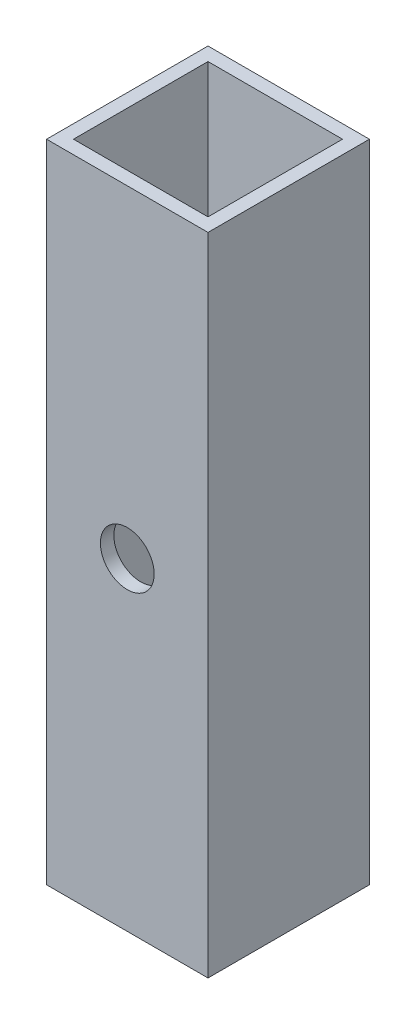
ISO-10303-21;
HEADER;
FILE_DESCRIPTION(('STEP AP214'),'2;1');
FILE_NAME('part.step','',(''),(''),'','','');
FILE_SCHEMA(('AUTOMOTIVE_DESIGN { 1 0 10303 214 1 1 1 1 }'));
ENDSEC;
DATA;
#1=APPLICATION_CONTEXT('core data for automotive mechanical design processes');
#2=APPLICATION_PROTOCOL_DEFINITION('international standard','automotive_design',2000,#1);
#3=PRODUCT_CONTEXT('',#1,'mechanical');
#4=PRODUCT('Part','Part','',(#3));
#5=PRODUCT_RELATED_PRODUCT_CATEGORY('part','',(#4));
#6=PRODUCT_DEFINITION_FORMATION('','',#4);
#7=PRODUCT_DEFINITION_CONTEXT('part definition',#1,'design');
#8=PRODUCT_DEFINITION('design','',#6,#7);
#9=PRODUCT_DEFINITION_SHAPE('','',#8);
#10=(LENGTH_UNIT() NAMED_UNIT(*) SI_UNIT(.MILLI.,.METRE.));
#11=(NAMED_UNIT(*) PLANE_ANGLE_UNIT() SI_UNIT($,.RADIAN.));
#12=(NAMED_UNIT(*) SI_UNIT($,.STERADIAN.) SOLID_ANGLE_UNIT());
#13=UNCERTAINTY_MEASURE_WITH_UNIT(LENGTH_MEASURE(1.E-05),#10,'distance_accuracy_value','');
#14=(GEOMETRIC_REPRESENTATION_CONTEXT(3) GLOBAL_UNCERTAINTY_ASSIGNED_CONTEXT((#13)) GLOBAL_UNIT_ASSIGNED_CONTEXT((#10,
#11,#12)) REPRESENTATION_CONTEXT('',''));
#15=CARTESIAN_POINT('',(0.,0.,0.));
#16=DIRECTION('',(0.,0.,1.));
#17=DIRECTION('',(1.,0.,0.));
#18=AXIS2_PLACEMENT_3D('',#15,#16,#17);
#19=CARTESIAN_POINT('',(0.,152.4,0.));
#20=DIRECTION('',(0.,-1.,0.));
#21=DIRECTION('',(0.,0.,-1.));
#22=AXIS2_PLACEMENT_3D('',#19,#20,#21);
#23=PLANE('',#22);
#24=DIRECTION('',(0.,0.,1.));
#25=VECTOR('',#24,1.);
#26=CARTESIAN_POINT('',(0.,152.4,0.));
#27=LINE('',#26,#25);
#28=CARTESIAN_POINT('',(0.,152.4,-38.1));
#29=VERTEX_POINT('',#28);
#30=CARTESIAN_POINT('',(0.,152.4,0.));
#31=VERTEX_POINT('',#30);
#32=EDGE_CURVE('E137',#29,#31,#27,.T.);
#33=ORIENTED_EDGE('',*,*,#32,.T.);
#34=DIRECTION('',(1.,0.,0.));
#35=VECTOR('',#34,1.);
#36=CARTESIAN_POINT('',(0.,152.4,0.));
#37=LINE('',#36,#35);
#38=CARTESIAN_POINT('',(38.1,152.4,0.));
#39=VERTEX_POINT('',#38);
#40=EDGE_CURVE('E140',#31,#39,#37,.T.);
#41=ORIENTED_EDGE('',*,*,#40,.T.);
#42=DIRECTION('',(0.,0.,-1.));
#43=VECTOR('',#42,1.);
#44=CARTESIAN_POINT('',(38.1,152.4,0.));
#45=LINE('',#44,#43);
#46=CARTESIAN_POINT('',(38.1,152.4,-38.1));
#47=VERTEX_POINT('',#46);
#48=EDGE_CURVE('E143',#39,#47,#45,.T.);
#49=ORIENTED_EDGE('',*,*,#48,.T.);
#50=DIRECTION('',(-1.,0.,0.));
#51=VECTOR('',#50,1.);
#52=CARTESIAN_POINT('',(0.,152.4,-38.1));
#53=LINE('',#52,#51);
#54=EDGE_CURVE('E145',#47,#29,#53,.T.);
#55=ORIENTED_EDGE('',*,*,#54,.T.);
#56=EDGE_LOOP('',(#33,#41,#49,#55));
#57=FACE_BOUND('',#56,.T.);
#58=DIRECTION('',(0.,0.,1.));
#59=VECTOR('',#58,1.);
#60=CARTESIAN_POINT('',(3.175,152.4,-3.175));
#61=LINE('',#60,#59);
#62=CARTESIAN_POINT('',(3.175,152.4,-34.925));
#63=VERTEX_POINT('',#62);
#64=CARTESIAN_POINT('',(3.175,152.4,-3.175));
#65=VERTEX_POINT('',#64);
#66=EDGE_CURVE('E99',#63,#65,#61,.T.);
#67=ORIENTED_EDGE('',*,*,#66,.F.);
#68=DIRECTION('',(-1.,0.,0.));
#69=VECTOR('',#68,1.);
#70=CARTESIAN_POINT('',(3.175,152.4,-34.925));
#71=LINE('',#70,#69);
#72=CARTESIAN_POINT('',(34.925,152.4,-34.925));
#73=VERTEX_POINT('',#72);
#74=EDGE_CURVE('E121',#73,#63,#71,.T.);
#75=ORIENTED_EDGE('',*,*,#74,.F.);
#76=DIRECTION('',(0.,0.,-1.));
#77=VECTOR('',#76,1.);
#78=CARTESIAN_POINT('',(34.925,152.4,-3.175));
#79=LINE('',#78,#77);
#80=CARTESIAN_POINT('',(34.925,152.4,-3.175));
#81=VERTEX_POINT('',#80);
#82=EDGE_CURVE('E119',#81,#73,#79,.T.);
#83=ORIENTED_EDGE('',*,*,#82,.F.);
#84=DIRECTION('',(1.,0.,0.));
#85=VECTOR('',#84,1.);
#86=CARTESIAN_POINT('',(3.175,152.4,-3.175));
#87=LINE('',#86,#85);
#88=EDGE_CURVE('E107',#65,#81,#87,.T.);
#89=ORIENTED_EDGE('',*,*,#88,.F.);
#90=EDGE_LOOP('',(#67,#75,#83,#89));
#91=FACE_BOUND('',#90,.T.);
#92=ADVANCED_FACE('F34',(#57,#91),#23,.F.);
#93=CARTESIAN_POINT('',(0.,0.,0.));
#94=DIRECTION('',(0.,-1.,0.));
#95=DIRECTION('',(0.,0.,-1.));
#96=AXIS2_PLACEMENT_3D('',#93,#94,#95);
#97=PLANE('',#96);
#98=DIRECTION('',(0.,0.,1.));
#99=VECTOR('',#98,1.);
#100=CARTESIAN_POINT('',(0.,0.,0.));
#101=LINE('',#100,#99);
#102=CARTESIAN_POINT('',(0.,0.,-38.1));
#103=VERTEX_POINT('',#102);
#104=CARTESIAN_POINT('',(0.,0.,0.));
#105=VERTEX_POINT('',#104);
#106=EDGE_CURVE('E115',#103,#105,#101,.T.);
#107=ORIENTED_EDGE('',*,*,#106,.F.);
#108=DIRECTION('',(-1.,0.,0.));
#109=VECTOR('',#108,1.);
#110=CARTESIAN_POINT('',(0.,0.,-38.1));
#111=LINE('',#110,#109);
#112=CARTESIAN_POINT('',(38.1,0.,-38.1));
#113=VERTEX_POINT('',#112);
#114=EDGE_CURVE('E141',#113,#103,#111,.T.);
#115=ORIENTED_EDGE('',*,*,#114,.F.);
#116=DIRECTION('',(0.,0.,-1.));
#117=VECTOR('',#116,1.);
#118=CARTESIAN_POINT('',(38.1,0.,0.));
#119=LINE('',#118,#117);
#120=CARTESIAN_POINT('',(38.1,0.,0.));
#121=VERTEX_POINT('',#120);
#122=EDGE_CURVE('E152',#121,#113,#119,.T.);
#123=ORIENTED_EDGE('',*,*,#122,.F.);
#124=DIRECTION('',(1.,0.,0.));
#125=VECTOR('',#124,1.);
#126=CARTESIAN_POINT('',(0.,0.,0.));
#127=LINE('',#126,#125);
#128=EDGE_CURVE('E150',#105,#121,#127,.T.);
#129=ORIENTED_EDGE('',*,*,#128,.F.);
#130=EDGE_LOOP('',(#107,#115,#123,#129));
#131=FACE_BOUND('',#130,.T.);
#132=DIRECTION('',(-1.,0.,0.));
#133=VECTOR('',#132,1.);
#134=CARTESIAN_POINT('',(3.175,0.,-34.925));
#135=LINE('',#134,#133);
#136=CARTESIAN_POINT('',(34.925,0.,-34.925));
#137=VERTEX_POINT('',#136);
#138=CARTESIAN_POINT('',(3.175,0.,-34.925));
#139=VERTEX_POINT('',#138);
#140=EDGE_CURVE('E108',#137,#139,#135,.T.);
#141=ORIENTED_EDGE('',*,*,#140,.T.);
#142=DIRECTION('',(0.,0.,1.));
#143=VECTOR('',#142,1.);
#144=CARTESIAN_POINT('',(3.175,0.,-3.175));
#145=LINE('',#144,#143);
#146=CARTESIAN_POINT('',(3.175,0.,-3.175));
#147=VERTEX_POINT('',#146);
#148=EDGE_CURVE('E57',#139,#147,#145,.T.);
#149=ORIENTED_EDGE('',*,*,#148,.T.);
#150=DIRECTION('',(1.,0.,0.));
#151=VECTOR('',#150,1.);
#152=CARTESIAN_POINT('',(3.175,0.,-3.175));
#153=LINE('',#152,#151);
#154=CARTESIAN_POINT('',(34.925,0.,-3.175));
#155=VERTEX_POINT('',#154);
#156=EDGE_CURVE('E114',#147,#155,#153,.T.);
#157=ORIENTED_EDGE('',*,*,#156,.T.);
#158=DIRECTION('',(0.,0.,-1.));
#159=VECTOR('',#158,1.);
#160=CARTESIAN_POINT('',(34.925,0.,-3.175));
#161=LINE('',#160,#159);
#162=EDGE_CURVE('E129',#155,#137,#161,.T.);
#163=ORIENTED_EDGE('',*,*,#162,.T.);
#164=EDGE_LOOP('',(#141,#149,#157,#163));
#165=FACE_BOUND('',#164,.T.);
#166=ADVANCED_FACE('F170',(#131,#165),#97,.T.);
#167=CARTESIAN_POINT('',(0.,152.4,0.));
#168=DIRECTION('',(1.,0.,0.));
#169=DIRECTION('',(0.,0.,-1.));
#170=AXIS2_PLACEMENT_3D('',#167,#168,#169);
#171=PLANE('',#170);
#172=ORIENTED_EDGE('',*,*,#106,.T.);
#173=DIRECTION('',(0.,-1.,0.));
#174=VECTOR('',#173,1.);
#175=CARTESIAN_POINT('',(0.,152.4,0.));
#176=LINE('',#175,#174);
#177=EDGE_CURVE('E11',#31,#105,#176,.T.);
#178=ORIENTED_EDGE('',*,*,#177,.F.);
#179=ORIENTED_EDGE('',*,*,#32,.F.);
#180=DIRECTION('',(0.,-1.,0.));
#181=VECTOR('',#180,1.);
#182=CARTESIAN_POINT('',(0.,152.4,-38.1));
#183=LINE('',#182,#181);
#184=EDGE_CURVE('E147',#29,#103,#183,.T.);
#185=ORIENTED_EDGE('',*,*,#184,.T.);
#186=EDGE_LOOP('',(#172,#178,#179,#185));
#187=FACE_BOUND('',#186,.T.);
#188=ADVANCED_FACE('F36',(#187),#171,.F.);
#189=CARTESIAN_POINT('',(0.,152.4,0.));
#190=DIRECTION('',(0.,0.,-1.));
#191=DIRECTION('',(-1.,0.,0.));
#192=AXIS2_PLACEMENT_3D('',#189,#190,#191);
#193=PLANE('',#192);
#194=CARTESIAN_POINT('',(19.05,76.2,0.));
#195=DIRECTION('',(0.,0.,1.));
#196=DIRECTION('',(1.,0.,0.));
#197=AXIS2_PLACEMENT_3D('',#194,#195,#196);
#198=CIRCLE('',#197,6.35);
#199=CARTESIAN_POINT('',(25.4,76.2,0.));
#200=VERTEX_POINT('',#199);
#201=EDGE_CURVE('E208',#200,#200,#198,.T.);
#202=ORIENTED_EDGE('',*,*,#201,.F.);
#203=EDGE_LOOP('',(#202));
#204=FACE_BOUND('',#203,.T.);
#205=ORIENTED_EDGE('',*,*,#128,.T.);
#206=DIRECTION('',(0.,-1.,0.));
#207=VECTOR('',#206,1.);
#208=CARTESIAN_POINT('',(38.1,152.4,0.));
#209=LINE('',#208,#207);
#210=EDGE_CURVE('E42',#39,#121,#209,.T.);
#211=ORIENTED_EDGE('',*,*,#210,.F.);
#212=ORIENTED_EDGE('',*,*,#40,.F.);
#213=ORIENTED_EDGE('',*,*,#177,.T.);
#214=EDGE_LOOP('',(#205,#211,#212,#213));
#215=FACE_BOUND('',#214,.T.);
#216=ADVANCED_FACE('F180',(#204,#215),#193,.F.);
#217=CARTESIAN_POINT('',(38.1,152.4,0.));
#218=DIRECTION('',(-1.,0.,0.));
#219=DIRECTION('',(0.,0.,1.));
#220=AXIS2_PLACEMENT_3D('',#217,#218,#219);
#221=PLANE('',#220);
#222=ORIENTED_EDGE('',*,*,#122,.T.);
#223=DIRECTION('',(0.,-1.,0.));
#224=VECTOR('',#223,1.);
#225=CARTESIAN_POINT('',(38.1,152.4,-38.1));
#226=LINE('',#225,#224);
#227=EDGE_CURVE('E157',#47,#113,#226,.T.);
#228=ORIENTED_EDGE('',*,*,#227,.F.);
#229=ORIENTED_EDGE('',*,*,#48,.F.);
#230=ORIENTED_EDGE('',*,*,#210,.T.);
#231=EDGE_LOOP('',(#222,#228,#229,#230));
#232=FACE_BOUND('',#231,.T.);
#233=ADVANCED_FACE('F164',(#232),#221,.F.);
#234=CARTESIAN_POINT('',(0.,152.4,-38.1));
#235=DIRECTION('',(0.,0.,1.));
#236=DIRECTION('',(1.,0.,0.));
#237=AXIS2_PLACEMENT_3D('',#234,#235,#236);
#238=PLANE('',#237);
#239=CARTESIAN_POINT('',(19.05,76.2,-38.1));
#240=DIRECTION('',(0.,0.,1.));
#241=DIRECTION('',(1.,0.,0.));
#242=AXIS2_PLACEMENT_3D('',#239,#240,#241);
#243=CIRCLE('',#242,6.34999999999999);
#244=CARTESIAN_POINT('',(25.4,76.2,-38.1));
#245=VERTEX_POINT('',#244);
#246=EDGE_CURVE('E205',#245,#245,#243,.T.);
#247=ORIENTED_EDGE('',*,*,#246,.T.);
#248=EDGE_LOOP('',(#247));
#249=FACE_BOUND('',#248,.T.);
#250=ORIENTED_EDGE('',*,*,#114,.T.);
#251=ORIENTED_EDGE('',*,*,#184,.F.);
#252=ORIENTED_EDGE('',*,*,#54,.F.);
#253=ORIENTED_EDGE('',*,*,#227,.T.);
#254=EDGE_LOOP('',(#250,#251,#252,#253));
#255=FACE_BOUND('',#254,.T.);
#256=ADVANCED_FACE('F174',(#249,#255),#238,.F.);
#257=CARTESIAN_POINT('',(3.175,152.4,-3.175));
#258=DIRECTION('',(1.,0.,0.));
#259=DIRECTION('',(0.,0.,-1.));
#260=AXIS2_PLACEMENT_3D('',#257,#258,#259);
#261=PLANE('',#260);
#262=ORIENTED_EDGE('',*,*,#148,.F.);
#263=DIRECTION('',(0.,-1.,0.));
#264=VECTOR('',#263,1.);
#265=CARTESIAN_POINT('',(3.175,152.4,-34.925));
#266=LINE('',#265,#264);
#267=EDGE_CURVE('E103',#63,#139,#266,.T.);
#268=ORIENTED_EDGE('',*,*,#267,.F.);
#269=ORIENTED_EDGE('',*,*,#66,.T.);
#270=DIRECTION('',(0.,-1.,0.));
#271=VECTOR('',#270,1.);
#272=CARTESIAN_POINT('',(3.175,152.4,-3.175));
#273=LINE('',#272,#271);
#274=EDGE_CURVE('E102',#65,#147,#273,.T.);
#275=ORIENTED_EDGE('',*,*,#274,.T.);
#276=EDGE_LOOP('',(#262,#268,#269,#275));
#277=FACE_BOUND('',#276,.T.);
#278=ADVANCED_FACE('F101',(#277),#261,.T.);
#279=CARTESIAN_POINT('',(3.175,152.4,-3.175));
#280=DIRECTION('',(0.,0.,-1.));
#281=DIRECTION('',(-1.,0.,0.));
#282=AXIS2_PLACEMENT_3D('',#279,#280,#281);
#283=PLANE('',#282);
#284=CARTESIAN_POINT('',(19.05,76.2,-3.175));
#285=DIRECTION('',(0.,0.,-1.));
#286=DIRECTION('',(-1.,0.,0.));
#287=AXIS2_PLACEMENT_3D('',#284,#285,#286);
#288=CIRCLE('',#287,6.34999999999999);
#289=CARTESIAN_POINT('',(12.7,76.2,-3.175));
#290=VERTEX_POINT('',#289);
#291=EDGE_CURVE('E127',#290,#290,#288,.T.);
#292=ORIENTED_EDGE('',*,*,#291,.F.);
#293=EDGE_LOOP('',(#292));
#294=FACE_BOUND('',#293,.T.);
#295=ORIENTED_EDGE('',*,*,#156,.F.);
#296=ORIENTED_EDGE('',*,*,#274,.F.);
#297=ORIENTED_EDGE('',*,*,#88,.T.);
#298=DIRECTION('',(0.,-1.,0.));
#299=VECTOR('',#298,1.);
#300=CARTESIAN_POINT('',(34.925,152.4,-3.175));
#301=LINE('',#300,#299);
#302=EDGE_CURVE('E116',#81,#155,#301,.T.);
#303=ORIENTED_EDGE('',*,*,#302,.T.);
#304=EDGE_LOOP('',(#295,#296,#297,#303));
#305=FACE_BOUND('',#304,.T.);
#306=ADVANCED_FACE('F111',(#294,#305),#283,.T.);
#307=CARTESIAN_POINT('',(34.925,152.4,-3.175));
#308=DIRECTION('',(-1.,0.,0.));
#309=DIRECTION('',(0.,0.,1.));
#310=AXIS2_PLACEMENT_3D('',#307,#308,#309);
#311=PLANE('',#310);
#312=ORIENTED_EDGE('',*,*,#162,.F.);
#313=ORIENTED_EDGE('',*,*,#302,.F.);
#314=ORIENTED_EDGE('',*,*,#82,.T.);
#315=DIRECTION('',(0.,-1.,0.));
#316=VECTOR('',#315,1.);
#317=CARTESIAN_POINT('',(34.925,152.4,-34.925));
#318=LINE('',#317,#316);
#319=EDGE_CURVE('E49',#73,#137,#318,.T.);
#320=ORIENTED_EDGE('',*,*,#319,.T.);
#321=EDGE_LOOP('',(#312,#313,#314,#320));
#322=FACE_BOUND('',#321,.T.);
#323=ADVANCED_FACE('F221',(#322),#311,.T.);
#324=CARTESIAN_POINT('',(3.175,152.4,-34.925));
#325=DIRECTION('',(0.,0.,1.));
#326=DIRECTION('',(1.,0.,0.));
#327=AXIS2_PLACEMENT_3D('',#324,#325,#326);
#328=PLANE('',#327);
#329=CARTESIAN_POINT('',(19.05,76.2,-34.925));
#330=DIRECTION('',(0.,0.,1.));
#331=DIRECTION('',(1.,0.,0.));
#332=AXIS2_PLACEMENT_3D('',#329,#330,#331);
#333=CIRCLE('',#332,6.34999999999999);
#334=CARTESIAN_POINT('',(25.4,76.2,-34.925));
#335=VERTEX_POINT('',#334);
#336=EDGE_CURVE('E207',#335,#335,#333,.T.);
#337=ORIENTED_EDGE('',*,*,#336,.F.);
#338=EDGE_LOOP('',(#337));
#339=FACE_BOUND('',#338,.T.);
#340=ORIENTED_EDGE('',*,*,#140,.F.);
#341=ORIENTED_EDGE('',*,*,#319,.F.);
#342=ORIENTED_EDGE('',*,*,#74,.T.);
#343=ORIENTED_EDGE('',*,*,#267,.T.);
#344=EDGE_LOOP('',(#340,#341,#342,#343));
#345=FACE_BOUND('',#344,.T.);
#346=ADVANCED_FACE('F225',(#339,#345),#328,.T.);
#347=CARTESIAN_POINT('',(19.05,76.2,0.));
#348=DIRECTION('',(0.,0.,1.));
#349=DIRECTION('',(1.,0.,0.));
#350=AXIS2_PLACEMENT_3D('',#347,#348,#349);
#351=CYLINDRICAL_SURFACE('',#350,6.34999999999999);
#352=ORIENTED_EDGE('',*,*,#336,.T.);
#353=EDGE_LOOP('',(#352));
#354=FACE_BOUND('',#353,.T.);
#355=ORIENTED_EDGE('',*,*,#246,.F.);
#356=EDGE_LOOP('',(#355));
#357=FACE_BOUND('',#356,.T.);
#358=ADVANCED_FACE('F231',(#354,#357),#351,.F.);
#359=ORIENTED_EDGE('',*,*,#291,.T.);
#360=EDGE_LOOP('',(#359));
#361=FACE_BOUND('',#360,.T.);
#362=ORIENTED_EDGE('',*,*,#201,.T.);
#363=EDGE_LOOP('',(#362));
#364=FACE_BOUND('',#363,.T.);
#365=ADVANCED_FACE('F217',(#361,#364),#351,.F.);
#366=CLOSED_SHELL('',(#92,#166,#188,#216,#233,#256,#278,#306,#323,#346,#358,#365));
#367=MANIFOLD_SOLID_BREP('B2',#366);
#368=ADVANCED_BREP_SHAPE_REPRESENTATION('',(#18,#367),#14);
#369=SHAPE_DEFINITION_REPRESENTATION(#9,#368);
ENDSEC;
END-ISO-10303-21;
